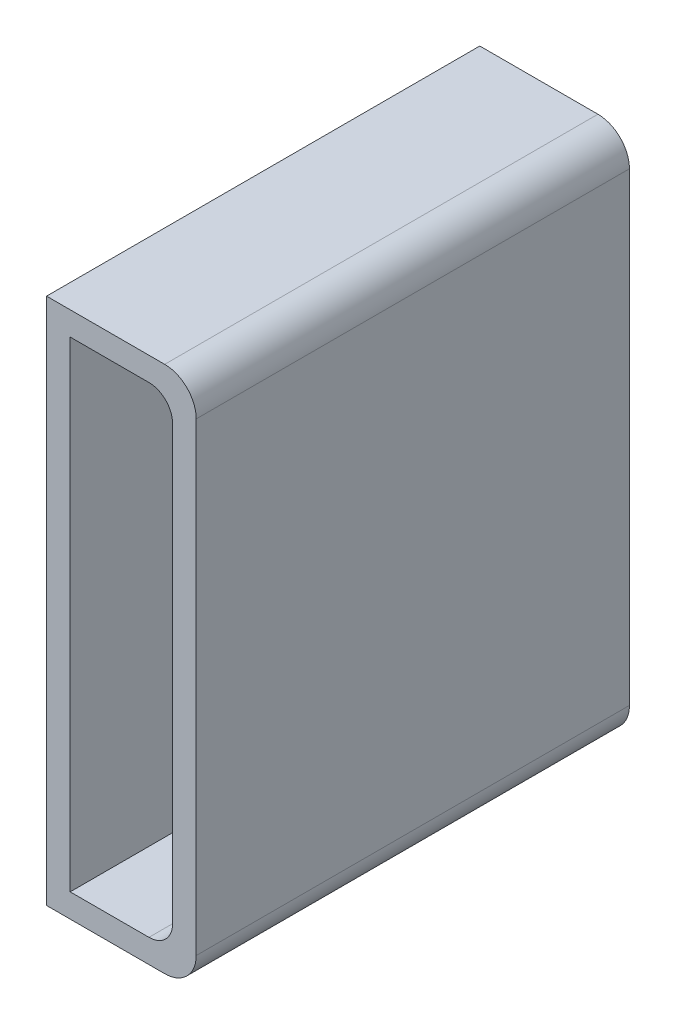
ISO-10303-21;
HEADER;
FILE_DESCRIPTION(('STEP AP214'),'2;1');
FILE_NAME('part.step','',(''),(''),'','','');
FILE_SCHEMA(('AUTOMOTIVE_DESIGN { 1 0 10303 214 1 1 1 1 }'));
ENDSEC;
DATA;
#1=APPLICATION_CONTEXT('core data for automotive mechanical design processes');
#2=APPLICATION_PROTOCOL_DEFINITION('international standard','automotive_design',2000,#1);
#3=PRODUCT_CONTEXT('',#1,'mechanical');
#4=PRODUCT('Part','Part','',(#3));
#5=PRODUCT_RELATED_PRODUCT_CATEGORY('part','',(#4));
#6=PRODUCT_DEFINITION_FORMATION('','',#4);
#7=PRODUCT_DEFINITION_CONTEXT('part definition',#1,'design');
#8=PRODUCT_DEFINITION('design','',#6,#7);
#9=PRODUCT_DEFINITION_SHAPE('','',#8);
#10=(LENGTH_UNIT() NAMED_UNIT(*) SI_UNIT(.MILLI.,.METRE.));
#11=(NAMED_UNIT(*) PLANE_ANGLE_UNIT() SI_UNIT($,.RADIAN.));
#12=(NAMED_UNIT(*) SI_UNIT($,.STERADIAN.) SOLID_ANGLE_UNIT());
#13=UNCERTAINTY_MEASURE_WITH_UNIT(LENGTH_MEASURE(1.E-05),#10,'distance_accuracy_value','');
#14=(GEOMETRIC_REPRESENTATION_CONTEXT(3) GLOBAL_UNCERTAINTY_ASSIGNED_CONTEXT((#13)) GLOBAL_UNIT_ASSIGNED_CONTEXT((#10,
#11,#12)) REPRESENTATION_CONTEXT('',''));
#15=CARTESIAN_POINT('',(0.,0.,0.));
#16=DIRECTION('',(0.,0.,1.));
#17=DIRECTION('',(1.,0.,0.));
#18=AXIS2_PLACEMENT_3D('',#15,#16,#17);
#19=CARTESIAN_POINT('',(19.,33.5,27.5));
#20=DIRECTION('',(0.,-1.,0.));
#21=DIRECTION('',(0.,0.,-1.));
#22=AXIS2_PLACEMENT_3D('',#19,#20,#21);
#23=PLANE('',#22);
#24=DIRECTION('',(-1.,0.,0.));
#25=VECTOR('',#24,1.);
#26=CARTESIAN_POINT('',(19.,33.5,27.5));
#27=LINE('',#26,#25);
#28=CARTESIAN_POINT('',(15.,33.5,27.5));
#29=VERTEX_POINT('',#28);
#30=CARTESIAN_POINT('',(0.,33.5,27.5));
#31=VERTEX_POINT('',#30);
#32=EDGE_CURVE('E202',#29,#31,#27,.T.);
#33=ORIENTED_EDGE('',*,*,#32,.F.);
#34=DIRECTION('',(0.,0.,1.));
#35=VECTOR('',#34,1.);
#36=CARTESIAN_POINT('',(15.,33.5,-27.5));
#37=LINE('',#36,#35);
#38=CARTESIAN_POINT('',(15.,33.5,-27.5));
#39=VERTEX_POINT('',#38);
#40=EDGE_CURVE('E219',#29,#39,#37,.F.);
#41=ORIENTED_EDGE('',*,*,#40,.T.);
#42=DIRECTION('',(-1.,0.,0.));
#43=VECTOR('',#42,1.);
#44=CARTESIAN_POINT('',(19.,33.5,-27.5));
#45=LINE('',#44,#43);
#46=CARTESIAN_POINT('',(0.,33.5,-27.5));
#47=VERTEX_POINT('',#46);
#48=EDGE_CURVE('E179',#39,#47,#45,.T.);
#49=ORIENTED_EDGE('',*,*,#48,.T.);
#50=DIRECTION('',(0.,0.,1.));
#51=VECTOR('',#50,1.);
#52=CARTESIAN_POINT('',(0.,33.5,27.5));
#53=LINE('',#52,#51);
#54=EDGE_CURVE('E168',#47,#31,#53,.T.);
#55=ORIENTED_EDGE('',*,*,#54,.T.);
#56=EDGE_LOOP('',(#33,#41,#49,#55));
#57=FACE_BOUND('',#56,.T.);
#58=ADVANCED_FACE('F47',(#57),#23,.F.);
#59=CARTESIAN_POINT('',(19.,-33.5,27.5));
#60=DIRECTION('',(0.,0.,-1.));
#61=DIRECTION('',(-1.,0.,0.));
#62=AXIS2_PLACEMENT_3D('',#59,#60,#61);
#63=PLANE('',#62);
#64=DIRECTION('',(0.,-1.,0.));
#65=VECTOR('',#64,1.);
#66=CARTESIAN_POINT('',(3.,30.5,27.5));
#67=LINE('',#66,#65);
#68=CARTESIAN_POINT('',(3.,30.5,27.5));
#69=VERTEX_POINT('',#68);
#70=CARTESIAN_POINT('',(3.,-30.5,27.5));
#71=VERTEX_POINT('',#70);
#72=EDGE_CURVE('E146',#69,#71,#67,.T.);
#73=ORIENTED_EDGE('',*,*,#72,.F.);
#74=DIRECTION('',(-1.,0.,0.));
#75=VECTOR('',#74,1.);
#76=CARTESIAN_POINT('',(16.,30.5,27.5));
#77=LINE('',#76,#75);
#78=CARTESIAN_POINT('',(13.,30.5,27.5));
#79=VERTEX_POINT('',#78);
#80=EDGE_CURVE('E151',#79,#69,#77,.T.);
#81=ORIENTED_EDGE('',*,*,#80,.F.);
#82=CARTESIAN_POINT('',(13.,27.5,27.5));
#83=DIRECTION('',(0.,0.,-1.));
#84=DIRECTION('',(-1.,0.,0.));
#85=AXIS2_PLACEMENT_3D('',#82,#83,#84);
#86=CIRCLE('',#85,3.);
#87=CARTESIAN_POINT('',(16.,27.5,27.5));
#88=VERTEX_POINT('',#87);
#89=EDGE_CURVE('E56',#79,#88,#86,.T.);
#90=ORIENTED_EDGE('',*,*,#89,.T.);
#91=DIRECTION('',(0.,1.,0.));
#92=VECTOR('',#91,1.);
#93=CARTESIAN_POINT('',(16.,-30.5,27.5));
#94=LINE('',#93,#92);
#95=CARTESIAN_POINT('',(16.,-27.5,27.5));
#96=VERTEX_POINT('',#95);
#97=EDGE_CURVE('E156',#96,#88,#94,.T.);
#98=ORIENTED_EDGE('',*,*,#97,.F.);
#99=CARTESIAN_POINT('',(13.,-27.5,27.5));
#100=DIRECTION('',(0.,0.,-1.));
#101=DIRECTION('',(-1.,0.,0.));
#102=AXIS2_PLACEMENT_3D('',#99,#100,#101);
#103=CIRCLE('',#102,3.);
#104=CARTESIAN_POINT('',(13.,-30.5,27.5));
#105=VERTEX_POINT('',#104);
#106=EDGE_CURVE('E12',#96,#105,#103,.T.);
#107=ORIENTED_EDGE('',*,*,#106,.T.);
#108=DIRECTION('',(1.,0.,0.));
#109=VECTOR('',#108,1.);
#110=CARTESIAN_POINT('',(3.,-30.5,27.5));
#111=LINE('',#110,#109);
#112=EDGE_CURVE('E137',#71,#105,#111,.T.);
#113=ORIENTED_EDGE('',*,*,#112,.F.);
#114=EDGE_LOOP('',(#73,#81,#90,#98,#107,#113));
#115=FACE_BOUND('',#114,.T.);
#116=DIRECTION('',(0.,-1.,0.));
#117=VECTOR('',#116,1.);
#118=CARTESIAN_POINT('',(19.,-33.5,27.5));
#119=LINE('',#118,#117);
#120=CARTESIAN_POINT('',(19.,29.5,27.5));
#121=VERTEX_POINT('',#120);
#122=CARTESIAN_POINT('',(19.,-29.5,27.5));
#123=VERTEX_POINT('',#122);
#124=EDGE_CURVE('E170',#121,#123,#119,.T.);
#125=ORIENTED_EDGE('',*,*,#124,.F.);
#126=CARTESIAN_POINT('',(15.,29.5,27.5));
#127=DIRECTION('',(0.,0.,-1.));
#128=DIRECTION('',(-1.,0.,0.));
#129=AXIS2_PLACEMENT_3D('',#126,#127,#128);
#130=CIRCLE('',#129,4.);
#131=EDGE_CURVE('E216',#121,#29,#130,.F.);
#132=ORIENTED_EDGE('',*,*,#131,.T.);
#133=ORIENTED_EDGE('',*,*,#32,.T.);
#134=DIRECTION('',(0.,-1.,0.));
#135=VECTOR('',#134,1.);
#136=CARTESIAN_POINT('',(0.,-33.5,27.5));
#137=LINE('',#136,#135);
#138=CARTESIAN_POINT('',(0.,-33.5,27.5));
#139=VERTEX_POINT('',#138);
#140=EDGE_CURVE('E183',#31,#139,#137,.T.);
#141=ORIENTED_EDGE('',*,*,#140,.T.);
#142=DIRECTION('',(-1.,0.,0.));
#143=VECTOR('',#142,1.);
#144=CARTESIAN_POINT('',(19.,-33.5,27.5));
#145=LINE('',#144,#143);
#146=CARTESIAN_POINT('',(15.,-33.5,27.5));
#147=VERTEX_POINT('',#146);
#148=EDGE_CURVE('E199',#147,#139,#145,.T.);
#149=ORIENTED_EDGE('',*,*,#148,.F.);
#150=CARTESIAN_POINT('',(15.,-29.5,27.5));
#151=DIRECTION('',(0.,0.,-1.));
#152=DIRECTION('',(-1.,0.,0.));
#153=AXIS2_PLACEMENT_3D('',#150,#151,#152);
#154=CIRCLE('',#153,4.);
#155=EDGE_CURVE('E213',#147,#123,#154,.F.);
#156=ORIENTED_EDGE('',*,*,#155,.T.);
#157=EDGE_LOOP('',(#125,#132,#133,#141,#149,#156));
#158=FACE_BOUND('',#157,.T.);
#159=ADVANCED_FACE('F153',(#115,#158),#63,.F.);
#160=CARTESIAN_POINT('',(19.,-33.5,27.5));
#161=DIRECTION('',(0.,1.,0.));
#162=DIRECTION('',(0.,0.,1.));
#163=AXIS2_PLACEMENT_3D('',#160,#161,#162);
#164=PLANE('',#163);
#165=DIRECTION('',(-1.,0.,0.));
#166=VECTOR('',#165,1.);
#167=CARTESIAN_POINT('',(19.,-33.5,-27.5));
#168=LINE('',#167,#166);
#169=CARTESIAN_POINT('',(15.,-33.5,-27.5));
#170=VERTEX_POINT('',#169);
#171=CARTESIAN_POINT('',(0.,-33.5,-27.5));
#172=VERTEX_POINT('',#171);
#173=EDGE_CURVE('E196',#170,#172,#168,.T.);
#174=ORIENTED_EDGE('',*,*,#173,.F.);
#175=DIRECTION('',(0.,0.,-1.));
#176=VECTOR('',#175,1.);
#177=CARTESIAN_POINT('',(15.,-33.5,27.5));
#178=LINE('',#177,#176);
#179=EDGE_CURVE('E228',#170,#147,#178,.F.);
#180=ORIENTED_EDGE('',*,*,#179,.T.);
#181=ORIENTED_EDGE('',*,*,#148,.T.);
#182=DIRECTION('',(0.,0.,-1.));
#183=VECTOR('',#182,1.);
#184=CARTESIAN_POINT('',(0.,-33.5,27.5));
#185=LINE('',#184,#183);
#186=EDGE_CURVE('E187',#139,#172,#185,.T.);
#187=ORIENTED_EDGE('',*,*,#186,.T.);
#188=EDGE_LOOP('',(#174,#180,#181,#187));
#189=FACE_BOUND('',#188,.T.);
#190=ADVANCED_FACE('F289',(#189),#164,.F.);
#191=CARTESIAN_POINT('',(19.,-33.5,-27.5));
#192=DIRECTION('',(0.,0.,1.));
#193=DIRECTION('',(1.,0.,0.));
#194=AXIS2_PLACEMENT_3D('',#191,#192,#193);
#195=PLANE('',#194);
#196=ORIENTED_EDGE('',*,*,#48,.F.);
#197=CARTESIAN_POINT('',(15.,29.5,-27.5));
#198=DIRECTION('',(0.,0.,1.));
#199=DIRECTION('',(1.,0.,0.));
#200=AXIS2_PLACEMENT_3D('',#197,#198,#199);
#201=CIRCLE('',#200,4.);
#202=CARTESIAN_POINT('',(19.,29.5,-27.5));
#203=VERTEX_POINT('',#202);
#204=EDGE_CURVE('E225',#39,#203,#201,.F.);
#205=ORIENTED_EDGE('',*,*,#204,.T.);
#206=DIRECTION('',(0.,1.,0.));
#207=VECTOR('',#206,1.);
#208=CARTESIAN_POINT('',(19.,-33.5,-27.5));
#209=LINE('',#208,#207);
#210=CARTESIAN_POINT('',(19.,-29.5,-27.5));
#211=VERTEX_POINT('',#210);
#212=EDGE_CURVE('E174',#211,#203,#209,.T.);
#213=ORIENTED_EDGE('',*,*,#212,.F.);
#214=CARTESIAN_POINT('',(15.,-29.5,-27.5));
#215=DIRECTION('',(0.,0.,1.));
#216=DIRECTION('',(1.,0.,0.));
#217=AXIS2_PLACEMENT_3D('',#214,#215,#216);
#218=CIRCLE('',#217,4.);
#219=EDGE_CURVE('E222',#211,#170,#218,.F.);
#220=ORIENTED_EDGE('',*,*,#219,.T.);
#221=ORIENTED_EDGE('',*,*,#173,.T.);
#222=DIRECTION('',(0.,1.,0.));
#223=VECTOR('',#222,1.);
#224=CARTESIAN_POINT('',(0.,-33.5,-27.5));
#225=LINE('',#224,#223);
#226=EDGE_CURVE('E175',#172,#47,#225,.T.);
#227=ORIENTED_EDGE('',*,*,#226,.T.);
#228=EDGE_LOOP('',(#196,#205,#213,#220,#221,#227));
#229=FACE_BOUND('',#228,.T.);
#230=ADVANCED_FACE('F323',(#229),#195,.F.);
#231=CARTESIAN_POINT('',(19.,0.,0.));
#232=DIRECTION('',(1.,0.,0.));
#233=DIRECTION('',(0.,0.,-1.));
#234=AXIS2_PLACEMENT_3D('',#231,#232,#233);
#235=PLANE('',#234);
#236=ORIENTED_EDGE('',*,*,#212,.T.);
#237=DIRECTION('',(0.,0.,1.));
#238=VECTOR('',#237,1.);
#239=CARTESIAN_POINT('',(19.,29.5,27.5));
#240=LINE('',#239,#238);
#241=EDGE_CURVE('E209',#203,#121,#240,.T.);
#242=ORIENTED_EDGE('',*,*,#241,.T.);
#243=ORIENTED_EDGE('',*,*,#124,.T.);
#244=DIRECTION('',(0.,0.,-1.));
#245=VECTOR('',#244,1.);
#246=CARTESIAN_POINT('',(19.,-29.5,-27.5));
#247=LINE('',#246,#245);
#248=EDGE_CURVE('E205',#123,#211,#247,.T.);
#249=ORIENTED_EDGE('',*,*,#248,.T.);
#250=EDGE_LOOP('',(#236,#242,#243,#249));
#251=FACE_BOUND('',#250,.T.);
#252=ADVANCED_FACE('F308',(#251),#235,.T.);
#253=CARTESIAN_POINT('',(0.,0.,0.));
#254=DIRECTION('',(1.,0.,0.));
#255=DIRECTION('',(0.,0.,-1.));
#256=AXIS2_PLACEMENT_3D('',#253,#254,#255);
#257=PLANE('',#256);
#258=ORIENTED_EDGE('',*,*,#54,.F.);
#259=ORIENTED_EDGE('',*,*,#226,.F.);
#260=ORIENTED_EDGE('',*,*,#186,.F.);
#261=ORIENTED_EDGE('',*,*,#140,.F.);
#262=EDGE_LOOP('',(#258,#259,#260,#261));
#263=FACE_BOUND('',#262,.T.);
#264=ADVANCED_FACE('F318',(#263),#257,.F.);
#265=CARTESIAN_POINT('',(16.,30.5,-89.8698645180507));
#266=DIRECTION('',(0.,1.,0.));
#267=DIRECTION('',(0.,0.,1.));
#268=AXIS2_PLACEMENT_3D('',#265,#266,#267);
#269=PLANE('',#268);
#270=DIRECTION('',(1.,0.,0.));
#271=VECTOR('',#270,1.);
#272=CARTESIAN_POINT('',(16.,30.5,-23.5));
#273=LINE('',#272,#271);
#274=CARTESIAN_POINT('',(3.,30.5,-23.5));
#275=VERTEX_POINT('',#274);
#276=CARTESIAN_POINT('',(13.,30.5,-23.5));
#277=VERTEX_POINT('',#276);
#278=EDGE_CURVE('E169',#275,#277,#273,.T.);
#279=ORIENTED_EDGE('',*,*,#278,.T.);
#280=DIRECTION('',(0.,0.,1.));
#281=VECTOR('',#280,1.);
#282=CARTESIAN_POINT('',(13.,30.5,27.5));
#283=LINE('',#282,#281);
#284=EDGE_CURVE('E231',#277,#79,#283,.T.);
#285=ORIENTED_EDGE('',*,*,#284,.T.);
#286=ORIENTED_EDGE('',*,*,#80,.T.);
#287=DIRECTION('',(0.,0.,1.));
#288=VECTOR('',#287,1.);
#289=CARTESIAN_POINT('',(3.,30.5,-89.8698645180507));
#290=LINE('',#289,#288);
#291=EDGE_CURVE('E142',#275,#69,#290,.T.);
#292=ORIENTED_EDGE('',*,*,#291,.F.);
#293=EDGE_LOOP('',(#279,#285,#286,#292));
#294=FACE_BOUND('',#293,.T.);
#295=ADVANCED_FACE('F266',(#294),#269,.F.);
#296=CARTESIAN_POINT('',(16.,-30.5,-89.8698645180507));
#297=DIRECTION('',(1.,0.,0.));
#298=DIRECTION('',(0.,0.,-1.));
#299=AXIS2_PLACEMENT_3D('',#296,#297,#298);
#300=PLANE('',#299);
#301=ORIENTED_EDGE('',*,*,#97,.T.);
#302=DIRECTION('',(0.,0.,1.));
#303=VECTOR('',#302,1.);
#304=CARTESIAN_POINT('',(16.,27.5,-23.5));
#305=LINE('',#304,#303);
#306=CARTESIAN_POINT('',(16.,27.5,-23.5));
#307=VERTEX_POINT('',#306);
#308=EDGE_CURVE('E239',#88,#307,#305,.F.);
#309=ORIENTED_EDGE('',*,*,#308,.T.);
#310=DIRECTION('',(0.,-1.,0.));
#311=VECTOR('',#310,1.);
#312=CARTESIAN_POINT('',(16.,-30.5,-23.5));
#313=LINE('',#312,#311);
#314=CARTESIAN_POINT('',(16.,-27.5,-23.5));
#315=VERTEX_POINT('',#314);
#316=EDGE_CURVE('E264',#307,#315,#313,.T.);
#317=ORIENTED_EDGE('',*,*,#316,.T.);
#318=DIRECTION('',(0.,0.,1.));
#319=VECTOR('',#318,1.);
#320=CARTESIAN_POINT('',(16.,-27.5,27.5));
#321=LINE('',#320,#319);
#322=EDGE_CURVE('E235',#315,#96,#321,.T.);
#323=ORIENTED_EDGE('',*,*,#322,.T.);
#324=EDGE_LOOP('',(#301,#309,#317,#323));
#325=FACE_BOUND('',#324,.T.);
#326=ADVANCED_FACE('F254',(#325),#300,.F.);
#327=CARTESIAN_POINT('',(3.,-30.5,-89.8698645180507));
#328=DIRECTION('',(0.,-1.,0.));
#329=DIRECTION('',(0.,0.,-1.));
#330=AXIS2_PLACEMENT_3D('',#327,#328,#329);
#331=PLANE('',#330);
#332=ORIENTED_EDGE('',*,*,#112,.T.);
#333=DIRECTION('',(0.,0.,1.));
#334=VECTOR('',#333,1.);
#335=CARTESIAN_POINT('',(13.,-30.5,-23.5));
#336=LINE('',#335,#334);
#337=CARTESIAN_POINT('',(13.,-30.5,-23.5));
#338=VERTEX_POINT('',#337);
#339=EDGE_CURVE('E68',#105,#338,#336,.F.);
#340=ORIENTED_EDGE('',*,*,#339,.T.);
#341=DIRECTION('',(-1.,0.,0.));
#342=VECTOR('',#341,1.);
#343=CARTESIAN_POINT('',(3.,-30.5,-23.5));
#344=LINE('',#343,#342);
#345=CARTESIAN_POINT('',(3.,-30.5,-23.5));
#346=VERTEX_POINT('',#345);
#347=EDGE_CURVE('E138',#338,#346,#344,.T.);
#348=ORIENTED_EDGE('',*,*,#347,.T.);
#349=DIRECTION('',(0.,0.,1.));
#350=VECTOR('',#349,1.);
#351=CARTESIAN_POINT('',(3.,-30.5,-89.8698645180507));
#352=LINE('',#351,#350);
#353=EDGE_CURVE('E134',#346,#71,#352,.T.);
#354=ORIENTED_EDGE('',*,*,#353,.T.);
#355=EDGE_LOOP('',(#332,#340,#348,#354));
#356=FACE_BOUND('',#355,.T.);
#357=ADVANCED_FACE('F136',(#356),#331,.F.);
#358=CARTESIAN_POINT('',(3.,30.5,-89.8698645180507));
#359=DIRECTION('',(-1.,0.,0.));
#360=DIRECTION('',(0.,0.,1.));
#361=AXIS2_PLACEMENT_3D('',#358,#359,#360);
#362=PLANE('',#361);
#363=DIRECTION('',(0.,1.,0.));
#364=VECTOR('',#363,1.);
#365=CARTESIAN_POINT('',(3.,30.5,-23.5));
#366=LINE('',#365,#364);
#367=EDGE_CURVE('E165',#346,#275,#366,.T.);
#368=ORIENTED_EDGE('',*,*,#367,.T.);
#369=ORIENTED_EDGE('',*,*,#291,.T.);
#370=ORIENTED_EDGE('',*,*,#72,.T.);
#371=ORIENTED_EDGE('',*,*,#353,.F.);
#372=EDGE_LOOP('',(#368,#369,#370,#371));
#373=FACE_BOUND('',#372,.T.);
#374=ADVANCED_FACE('F147',(#373),#362,.F.);
#375=CARTESIAN_POINT('',(19.,-33.5,-23.5));
#376=DIRECTION('',(0.,0.,1.));
#377=DIRECTION('',(1.,0.,0.));
#378=AXIS2_PLACEMENT_3D('',#375,#376,#377);
#379=PLANE('',#378);
#380=ORIENTED_EDGE('',*,*,#316,.F.);
#381=CARTESIAN_POINT('',(13.,27.5,-23.5));
#382=DIRECTION('',(0.,0.,1.));
#383=DIRECTION('',(1.,0.,0.));
#384=AXIS2_PLACEMENT_3D('',#381,#382,#383);
#385=CIRCLE('',#384,3.);
#386=EDGE_CURVE('E245',#307,#277,#385,.T.);
#387=ORIENTED_EDGE('',*,*,#386,.T.);
#388=ORIENTED_EDGE('',*,*,#278,.F.);
#389=ORIENTED_EDGE('',*,*,#367,.F.);
#390=ORIENTED_EDGE('',*,*,#347,.F.);
#391=CARTESIAN_POINT('',(13.,-27.5,-23.5));
#392=DIRECTION('',(0.,0.,1.));
#393=DIRECTION('',(1.,0.,0.));
#394=AXIS2_PLACEMENT_3D('',#391,#392,#393);
#395=CIRCLE('',#394,3.);
#396=EDGE_CURVE('E242',#338,#315,#395,.T.);
#397=ORIENTED_EDGE('',*,*,#396,.T.);
#398=EDGE_LOOP('',(#380,#387,#388,#389,#390,#397));
#399=FACE_BOUND('',#398,.T.);
#400=ADVANCED_FACE('F263',(#399),#379,.T.);
#401=CARTESIAN_POINT('',(15.,29.5,0.));
#402=DIRECTION('',(0.,0.,-1.));
#403=DIRECTION('',(0.,1.,0.));
#404=AXIS2_PLACEMENT_3D('',#401,#402,#403);
#405=CYLINDRICAL_SURFACE('',#404,4.);
#406=ORIENTED_EDGE('',*,*,#204,.F.);
#407=ORIENTED_EDGE('',*,*,#40,.F.);
#408=ORIENTED_EDGE('',*,*,#131,.F.);
#409=ORIENTED_EDGE('',*,*,#241,.F.);
#410=EDGE_LOOP('',(#406,#407,#408,#409));
#411=FACE_BOUND('',#410,.T.);
#412=ADVANCED_FACE('F294',(#411),#405,.T.);
#413=CARTESIAN_POINT('',(15.,-29.5,0.));
#414=DIRECTION('',(0.,0.,1.));
#415=DIRECTION('',(1.,0.,0.));
#416=AXIS2_PLACEMENT_3D('',#413,#414,#415);
#417=CYLINDRICAL_SURFACE('',#416,4.);
#418=ORIENTED_EDGE('',*,*,#155,.F.);
#419=ORIENTED_EDGE('',*,*,#179,.F.);
#420=ORIENTED_EDGE('',*,*,#219,.F.);
#421=ORIENTED_EDGE('',*,*,#248,.F.);
#422=EDGE_LOOP('',(#418,#419,#420,#421));
#423=FACE_BOUND('',#422,.T.);
#424=ADVANCED_FACE('F280',(#423),#417,.T.);
#425=CARTESIAN_POINT('',(13.,27.5,-89.8698645180507));
#426=DIRECTION('',(0.,0.,-1.));
#427=DIRECTION('',(-1.,0.,0.));
#428=AXIS2_PLACEMENT_3D('',#425,#426,#427);
#429=CYLINDRICAL_SURFACE('',#428,3.);
#430=ORIENTED_EDGE('',*,*,#386,.F.);
#431=ORIENTED_EDGE('',*,*,#308,.F.);
#432=ORIENTED_EDGE('',*,*,#89,.F.);
#433=ORIENTED_EDGE('',*,*,#284,.F.);
#434=EDGE_LOOP('',(#430,#431,#432,#433));
#435=FACE_BOUND('',#434,.T.);
#436=ADVANCED_FACE('F259',(#435),#429,.F.);
#437=CARTESIAN_POINT('',(13.,-27.5,-89.8698645180507));
#438=DIRECTION('',(0.,0.,-1.));
#439=DIRECTION('',(-1.,0.,0.));
#440=AXIS2_PLACEMENT_3D('',#437,#438,#439);
#441=CYLINDRICAL_SURFACE('',#440,3.);
#442=ORIENTED_EDGE('',*,*,#396,.F.);
#443=ORIENTED_EDGE('',*,*,#339,.F.);
#444=ORIENTED_EDGE('',*,*,#106,.F.);
#445=ORIENTED_EDGE('',*,*,#322,.F.);
#446=EDGE_LOOP('',(#442,#443,#444,#445));
#447=FACE_BOUND('',#446,.T.);
#448=ADVANCED_FACE('F49',(#447),#441,.F.);
#449=CLOSED_SHELL('',(#58,#159,#190,#230,#252,#264,#295,#326,#357,#374,#400,#412,#424,#436,#448));
#450=MANIFOLD_SOLID_BREP('B2',#449);
#451=ADVANCED_BREP_SHAPE_REPRESENTATION('',(#18,#450),#14);
#452=SHAPE_DEFINITION_REPRESENTATION(#9,#451);
ENDSEC;
END-ISO-10303-21;
